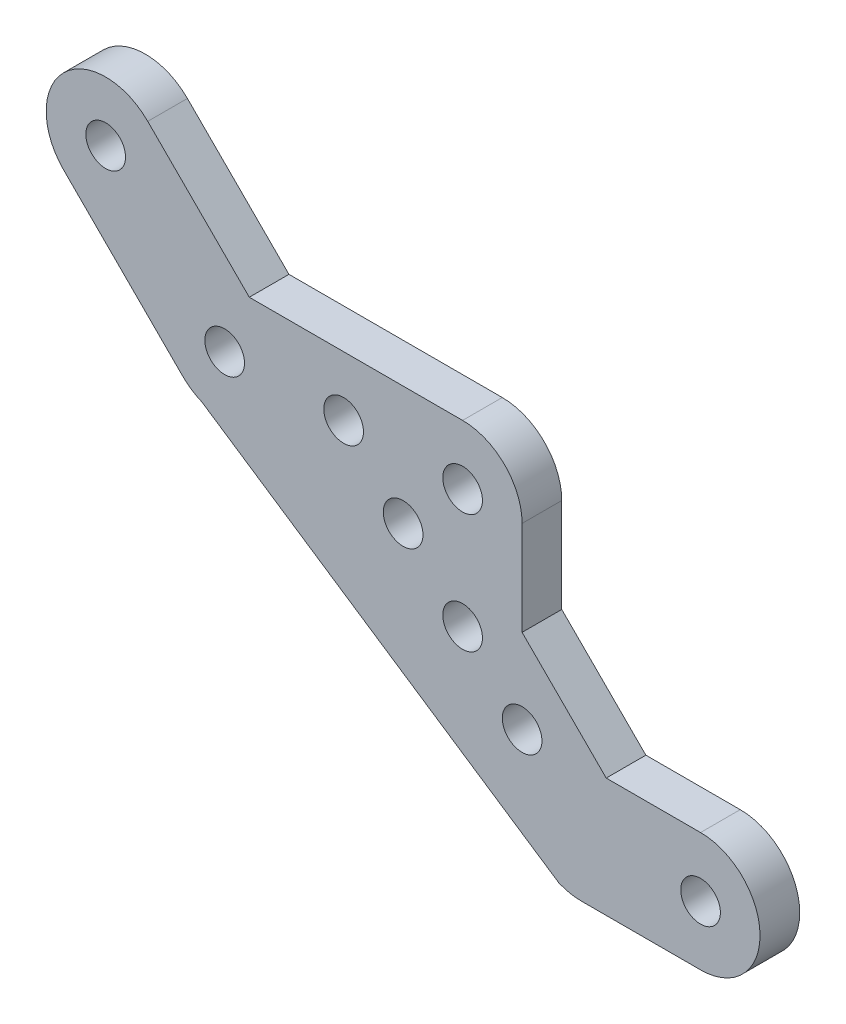
ISO-10303-21;
HEADER;
FILE_DESCRIPTION(('STEP AP214'),'2;1');
FILE_NAME('part.step','',(''),(''),'','','');
FILE_SCHEMA(('AUTOMOTIVE_DESIGN { 1 0 10303 214 1 1 1 1 }'));
ENDSEC;
DATA;
#1=APPLICATION_CONTEXT('core data for automotive mechanical design processes');
#2=APPLICATION_PROTOCOL_DEFINITION('international standard','automotive_design',2000,#1);
#3=PRODUCT_CONTEXT('',#1,'mechanical');
#4=PRODUCT('Part','Part','',(#3));
#5=PRODUCT_RELATED_PRODUCT_CATEGORY('part','',(#4));
#6=PRODUCT_DEFINITION_FORMATION('','',#4);
#7=PRODUCT_DEFINITION_CONTEXT('part definition',#1,'design');
#8=PRODUCT_DEFINITION('design','',#6,#7);
#9=PRODUCT_DEFINITION_SHAPE('','',#8);
#10=(LENGTH_UNIT() NAMED_UNIT(*) SI_UNIT(.MILLI.,.METRE.));
#11=(NAMED_UNIT(*) PLANE_ANGLE_UNIT() SI_UNIT($,.RADIAN.));
#12=(NAMED_UNIT(*) SI_UNIT($,.STERADIAN.) SOLID_ANGLE_UNIT());
#13=UNCERTAINTY_MEASURE_WITH_UNIT(LENGTH_MEASURE(1.E-05),#10,'distance_accuracy_value','');
#14=(GEOMETRIC_REPRESENTATION_CONTEXT(3) GLOBAL_UNCERTAINTY_ASSIGNED_CONTEXT((#13)) GLOBAL_UNIT_ASSIGNED_CONTEXT((#10,
#11,#12)) REPRESENTATION_CONTEXT('',''));
#15=CARTESIAN_POINT('',(0.,0.,0.));
#16=DIRECTION('',(0.,0.,1.));
#17=DIRECTION('',(1.,0.,0.));
#18=AXIS2_PLACEMENT_3D('',#15,#16,#17);
#19=CARTESIAN_POINT('',(215.821694642446,323.732541963669,3.));
#20=DIRECTION('',(0.554700196225229,0.832050294337844,0.));
#21=DIRECTION('',(-0.832050294337844,0.554700196225229,0.));
#22=AXIS2_PLACEMENT_3D('',#19,#20,#21);
#23=PLANE('',#22);
#24=DIRECTION('',(0.832050294337844,-0.554700196225229,0.));
#25=VECTOR('',#24,1.);
#26=CARTESIAN_POINT('',(215.821694642446,323.732541963669,0.));
#27=LINE('',#26,#25);
#28=CARTESIAN_POINT('',(421.5555703155,186.5766248483,0.));
#29=VERTEX_POINT('',#28);
#30=CARTESIAN_POINT('',(448.5555703155,168.5766248483,0.));
#31=VERTEX_POINT('',#30);
#32=EDGE_CURVE('E184',#29,#31,#27,.T.);
#33=ORIENTED_EDGE('',*,*,#32,.T.);
#34=DIRECTION('',(0.,0.,-1.));
#35=VECTOR('',#34,1.);
#36=CARTESIAN_POINT('',(448.5555703155,168.5766248483,3.));
#37=LINE('',#36,#35);
#38=CARTESIAN_POINT('',(448.5555703155,168.5766248483,3.));
#39=VERTEX_POINT('',#38);
#40=EDGE_CURVE('E11',#39,#31,#37,.T.);
#41=ORIENTED_EDGE('',*,*,#40,.F.);
#42=DIRECTION('',(0.832050294337844,-0.554700196225229,0.));
#43=VECTOR('',#42,1.);
#44=CARTESIAN_POINT('',(215.821694642446,323.732541963669,3.));
#45=LINE('',#44,#43);
#46=CARTESIAN_POINT('',(421.5555703155,186.5766248483,3.));
#47=VERTEX_POINT('',#46);
#48=EDGE_CURVE('E234',#47,#39,#45,.T.);
#49=ORIENTED_EDGE('',*,*,#48,.F.);
#50=DIRECTION('',(0.,0.,-1.));
#51=VECTOR('',#50,1.);
#52=CARTESIAN_POINT('',(421.5555703155,186.5766248483,3.));
#53=LINE('',#52,#51);
#54=EDGE_CURVE('E183',#47,#29,#53,.T.);
#55=ORIENTED_EDGE('',*,*,#54,.T.);
#56=EDGE_LOOP('',(#33,#41,#49,#55));
#57=FACE_BOUND('',#56,.T.);
#58=ADVANCED_FACE('F33',(#57),#23,.F.);
#59=CARTESIAN_POINT('',(450.2776457611,172.7340827446,3.));
#60=DIRECTION('',(0.,0.,-1.));
#61=DIRECTION('',(-1.,0.,0.));
#62=AXIS2_PLACEMENT_3D('',#59,#60,#61);
#63=CYLINDRICAL_SURFACE('',#62,4.49999999999142);
#64=CARTESIAN_POINT('',(450.2776457611,172.7340827446,0.));
#65=DIRECTION('',(0.,0.,1.));
#66=DIRECTION('',(1.,0.,0.));
#67=AXIS2_PLACEMENT_3D('',#64,#65,#66);
#68=CIRCLE('',#67,4.49999999999142);
#69=CARTESIAN_POINT('',(450.2776457611,168.2340827446,0.));
#70=VERTEX_POINT('',#69);
#71=EDGE_CURVE('E187',#31,#70,#68,.T.);
#72=ORIENTED_EDGE('',*,*,#71,.T.);
#73=DIRECTION('',(0.,0.,-1.));
#74=VECTOR('',#73,1.);
#75=CARTESIAN_POINT('',(450.2776457611,168.2340827446,3.));
#76=LINE('',#75,#74);
#77=CARTESIAN_POINT('',(450.2776457611,168.2340827446,3.));
#78=VERTEX_POINT('',#77);
#79=EDGE_CURVE('E41',#78,#70,#76,.T.);
#80=ORIENTED_EDGE('',*,*,#79,.F.);
#81=CARTESIAN_POINT('',(450.2776457611,172.7340827446,3.));
#82=DIRECTION('',(0.,0.,1.));
#83=DIRECTION('',(1.,0.,0.));
#84=AXIS2_PLACEMENT_3D('',#81,#82,#83);
#85=CIRCLE('',#84,4.49999999999142);
#86=EDGE_CURVE('E107',#39,#78,#85,.T.);
#87=ORIENTED_EDGE('',*,*,#86,.F.);
#88=ORIENTED_EDGE('',*,*,#40,.T.);
#89=EDGE_LOOP('',(#72,#80,#87,#88));
#90=FACE_BOUND('',#89,.T.);
#91=ADVANCED_FACE('F323',(#90),#63,.T.);
#92=CARTESIAN_POINT('',(0.,168.2340827446,3.));
#93=DIRECTION('',(0.,1.,0.));
#94=DIRECTION('',(0.,0.,1.));
#95=AXIS2_PLACEMENT_3D('',#92,#93,#94);
#96=PLANE('',#95);
#97=DIRECTION('',(1.,0.,0.));
#98=VECTOR('',#97,1.);
#99=CARTESIAN_POINT('',(0.,168.2340827446,0.));
#100=LINE('',#99,#98);
#101=CARTESIAN_POINT('',(459.2776457611,168.2340827446,0.));
#102=VERTEX_POINT('',#101);
#103=EDGE_CURVE('E189',#70,#102,#100,.T.);
#104=ORIENTED_EDGE('',*,*,#103,.T.);
#105=DIRECTION('',(0.,0.,-1.));
#106=VECTOR('',#105,1.);
#107=CARTESIAN_POINT('',(459.2776457611,168.2340827446,3.));
#108=LINE('',#107,#106);
#109=CARTESIAN_POINT('',(459.2776457611,168.2340827446,3.));
#110=VERTEX_POINT('',#109);
#111=EDGE_CURVE('E254',#110,#102,#108,.T.);
#112=ORIENTED_EDGE('',*,*,#111,.F.);
#113=DIRECTION('',(1.,0.,0.));
#114=VECTOR('',#113,1.);
#115=CARTESIAN_POINT('',(0.,168.2340827446,3.));
#116=LINE('',#115,#114);
#117=EDGE_CURVE('E262',#78,#110,#116,.T.);
#118=ORIENTED_EDGE('',*,*,#117,.F.);
#119=ORIENTED_EDGE('',*,*,#79,.T.);
#120=EDGE_LOOP('',(#104,#112,#118,#119));
#121=FACE_BOUND('',#120,.T.);
#122=ADVANCED_FACE('F260',(#121),#96,.F.);
#123=CARTESIAN_POINT('',(459.2776457611,172.7340827446,3.));
#124=DIRECTION('',(0.,0.,-1.));
#125=DIRECTION('',(-1.,0.,0.));
#126=AXIS2_PLACEMENT_3D('',#123,#124,#125);
#127=CYLINDRICAL_SURFACE('',#126,4.49999999999999);
#128=CARTESIAN_POINT('',(459.2776457611,172.7340827446,0.));
#129=DIRECTION('',(0.,0.,1.));
#130=DIRECTION('',(1.,0.,0.));
#131=AXIS2_PLACEMENT_3D('',#128,#129,#130);
#132=CIRCLE('',#131,4.49999999999999);
#133=CARTESIAN_POINT('',(459.2776457611,177.2340827446,0.));
#134=VERTEX_POINT('',#133);
#135=EDGE_CURVE('E191',#102,#134,#132,.T.);
#136=ORIENTED_EDGE('',*,*,#135,.T.);
#137=DIRECTION('',(0.,0.,-1.));
#138=VECTOR('',#137,1.);
#139=CARTESIAN_POINT('',(459.2776457611,177.2340827446,3.));
#140=LINE('',#139,#138);
#141=CARTESIAN_POINT('',(459.2776457611,177.2340827446,3.));
#142=VERTEX_POINT('',#141);
#143=EDGE_CURVE('E251',#142,#134,#140,.T.);
#144=ORIENTED_EDGE('',*,*,#143,.F.);
#145=CARTESIAN_POINT('',(459.2776457611,172.7340827446,3.));
#146=DIRECTION('',(0.,0.,1.));
#147=DIRECTION('',(1.,0.,0.));
#148=AXIS2_PLACEMENT_3D('',#145,#146,#147);
#149=CIRCLE('',#148,4.49999999999999);
#150=EDGE_CURVE('E281',#110,#142,#149,.T.);
#151=ORIENTED_EDGE('',*,*,#150,.F.);
#152=ORIENTED_EDGE('',*,*,#111,.T.);
#153=EDGE_LOOP('',(#136,#144,#151,#152));
#154=FACE_BOUND('',#153,.T.);
#155=ADVANCED_FACE('F272',(#154),#127,.T.);
#156=CARTESIAN_POINT('',(0.,177.2340827446,3.));
#157=DIRECTION('',(0.,-1.,0.));
#158=DIRECTION('',(0.,0.,-1.));
#159=AXIS2_PLACEMENT_3D('',#156,#157,#158);
#160=PLANE('',#159);
#161=DIRECTION('',(-1.,0.,0.));
#162=VECTOR('',#161,1.);
#163=CARTESIAN_POINT('',(0.,177.2340827446,0.));
#164=LINE('',#163,#162);
#165=CARTESIAN_POINT('',(452.1416067918,177.2340827446,0.));
#166=VERTEX_POINT('',#165);
#167=EDGE_CURVE('E193',#134,#166,#164,.T.);
#168=ORIENTED_EDGE('',*,*,#167,.T.);
#169=DIRECTION('',(0.,0.,-1.));
#170=VECTOR('',#169,1.);
#171=CARTESIAN_POINT('',(452.1416067918,177.2340827446,3.));
#172=LINE('',#171,#170);
#173=CARTESIAN_POINT('',(452.1416067918,177.2340827446,3.));
#174=VERTEX_POINT('',#173);
#175=EDGE_CURVE('E248',#174,#166,#172,.T.);
#176=ORIENTED_EDGE('',*,*,#175,.F.);
#177=DIRECTION('',(-1.,0.,0.));
#178=VECTOR('',#177,1.);
#179=CARTESIAN_POINT('',(0.,177.2340827446,3.));
#180=LINE('',#179,#178);
#181=EDGE_CURVE('E278',#142,#174,#180,.T.);
#182=ORIENTED_EDGE('',*,*,#181,.F.);
#183=ORIENTED_EDGE('',*,*,#143,.T.);
#184=EDGE_LOOP('',(#168,#176,#182,#183));
#185=FACE_BOUND('',#184,.T.);
#186=ADVANCED_FACE('F276',(#185),#160,.F.);
#187=CARTESIAN_POINT('',(314.687844768202,314.687844768199,3.));
#188=DIRECTION('',(-0.70710678118655,-0.707106781186544,0.));
#189=DIRECTION('',(0.707106781186545,-0.707106781186551,0.));
#190=AXIS2_PLACEMENT_3D('',#187,#188,#189);
#191=PLANE('',#190);
#192=DIRECTION('',(-0.707106781186544,0.707106781186551,0.));
#193=VECTOR('',#192,1.);
#194=CARTESIAN_POINT('',(314.687844768202,314.687844768199,0.));
#195=LINE('',#194,#193);
#196=CARTESIAN_POINT('',(445.7776457611,183.5980437753,0.));
#197=VERTEX_POINT('',#196);
#198=EDGE_CURVE('E195',#166,#197,#195,.T.);
#199=ORIENTED_EDGE('',*,*,#198,.T.);
#200=DIRECTION('',(0.,0.,-1.));
#201=VECTOR('',#200,1.);
#202=CARTESIAN_POINT('',(445.7776457611,183.5980437753,3.));
#203=LINE('',#202,#201);
#204=CARTESIAN_POINT('',(445.7776457611,183.5980437753,3.));
#205=VERTEX_POINT('',#204);
#206=EDGE_CURVE('E246',#205,#197,#203,.T.);
#207=ORIENTED_EDGE('',*,*,#206,.F.);
#208=DIRECTION('',(-0.707106781186544,0.707106781186551,0.));
#209=VECTOR('',#208,1.);
#210=CARTESIAN_POINT('',(314.687844768202,314.687844768199,3.));
#211=LINE('',#210,#209);
#212=EDGE_CURVE('E280',#174,#205,#211,.T.);
#213=ORIENTED_EDGE('',*,*,#212,.F.);
#214=ORIENTED_EDGE('',*,*,#175,.T.);
#215=EDGE_LOOP('',(#199,#207,#213,#214));
#216=FACE_BOUND('',#215,.T.);
#217=ADVANCED_FACE('F336',(#216),#191,.F.);
#218=CARTESIAN_POINT('',(445.7776457611,0.,3.));
#219=DIRECTION('',(1.,0.,0.));
#220=DIRECTION('',(0.,0.,-1.));
#221=AXIS2_PLACEMENT_3D('',#218,#219,#220);
#222=PLANE('',#221);
#223=DIRECTION('',(0.,-1.,0.));
#224=VECTOR('',#223,1.);
#225=CARTESIAN_POINT('',(445.7776457611,0.,0.));
#226=LINE('',#225,#224);
#227=CARTESIAN_POINT('',(445.7776457611,190.7340827446,0.));
#228=VERTEX_POINT('',#227);
#229=EDGE_CURVE('E198',#228,#197,#226,.T.);
#230=ORIENTED_EDGE('',*,*,#229,.F.);
#231=DIRECTION('',(0.,0.,-1.));
#232=VECTOR('',#231,1.);
#233=CARTESIAN_POINT('',(445.7776457611,190.7340827446,3.));
#234=LINE('',#233,#232);
#235=CARTESIAN_POINT('',(445.7776457611,190.7340827446,3.));
#236=VERTEX_POINT('',#235);
#237=EDGE_CURVE('E244',#236,#228,#234,.T.);
#238=ORIENTED_EDGE('',*,*,#237,.F.);
#239=DIRECTION('',(0.,-1.,0.));
#240=VECTOR('',#239,1.);
#241=CARTESIAN_POINT('',(445.7776457611,0.,3.));
#242=LINE('',#241,#240);
#243=EDGE_CURVE('E283',#236,#205,#242,.T.);
#244=ORIENTED_EDGE('',*,*,#243,.T.);
#245=ORIENTED_EDGE('',*,*,#206,.T.);
#246=EDGE_LOOP('',(#230,#238,#244,#245));
#247=FACE_BOUND('',#246,.T.);
#248=ADVANCED_FACE('F339',(#247),#222,.T.);
#249=CARTESIAN_POINT('',(441.2776457611,190.7340827446,3.));
#250=DIRECTION('',(0.,0.,-1.));
#251=DIRECTION('',(-1.,0.,0.));
#252=AXIS2_PLACEMENT_3D('',#249,#250,#251);
#253=CYLINDRICAL_SURFACE('',#252,4.5);
#254=CARTESIAN_POINT('',(441.2776457611,190.7340827446,0.));
#255=DIRECTION('',(0.,0.,1.));
#256=DIRECTION('',(1.,0.,0.));
#257=AXIS2_PLACEMENT_3D('',#254,#255,#256);
#258=CIRCLE('',#257,4.5);
#259=CARTESIAN_POINT('',(441.2776457611,195.2340827446,0.));
#260=VERTEX_POINT('',#259);
#261=EDGE_CURVE('E201',#228,#260,#258,.T.);
#262=ORIENTED_EDGE('',*,*,#261,.T.);
#263=DIRECTION('',(0.,0.,-1.));
#264=VECTOR('',#263,1.);
#265=CARTESIAN_POINT('',(441.2776457611,195.2340827446,3.));
#266=LINE('',#265,#264);
#267=CARTESIAN_POINT('',(441.2776457611,195.2340827446,3.));
#268=VERTEX_POINT('',#267);
#269=EDGE_CURVE('E241',#268,#260,#266,.T.);
#270=ORIENTED_EDGE('',*,*,#269,.F.);
#271=CARTESIAN_POINT('',(441.2776457611,190.7340827446,3.));
#272=DIRECTION('',(0.,0.,1.));
#273=DIRECTION('',(1.,0.,0.));
#274=AXIS2_PLACEMENT_3D('',#271,#272,#273);
#275=CIRCLE('',#274,4.5);
#276=EDGE_CURVE('E290',#236,#268,#275,.T.);
#277=ORIENTED_EDGE('',*,*,#276,.F.);
#278=ORIENTED_EDGE('',*,*,#237,.T.);
#279=EDGE_LOOP('',(#262,#270,#277,#278));
#280=FACE_BOUND('',#279,.T.);
#281=ADVANCED_FACE('F343',(#280),#253,.T.);
#282=CARTESIAN_POINT('',(0.,195.2340827446,3.));
#283=DIRECTION('',(0.,-1.,0.));
#284=DIRECTION('',(0.,0.,-1.));
#285=AXIS2_PLACEMENT_3D('',#282,#283,#284);
#286=PLANE('',#285);
#287=DIRECTION('',(-1.,0.,0.));
#288=VECTOR('',#287,1.);
#289=CARTESIAN_POINT('',(0.,195.2340827446,0.));
#290=LINE('',#289,#288);
#291=CARTESIAN_POINT('',(425.1416067918,195.2340827446,0.));
#292=VERTEX_POINT('',#291);
#293=EDGE_CURVE('E203',#260,#292,#290,.T.);
#294=ORIENTED_EDGE('',*,*,#293,.T.);
#295=DIRECTION('',(0.,0.,-1.));
#296=VECTOR('',#295,1.);
#297=CARTESIAN_POINT('',(425.1416067918,195.2340827446,3.));
#298=LINE('',#297,#296);
#299=CARTESIAN_POINT('',(425.1416067918,195.2340827446,3.));
#300=VERTEX_POINT('',#299);
#301=EDGE_CURVE('E238',#300,#292,#298,.T.);
#302=ORIENTED_EDGE('',*,*,#301,.F.);
#303=DIRECTION('',(-1.,0.,0.));
#304=VECTOR('',#303,1.);
#305=CARTESIAN_POINT('',(0.,195.2340827446,3.));
#306=LINE('',#305,#304);
#307=EDGE_CURVE('E292',#268,#300,#306,.T.);
#308=ORIENTED_EDGE('',*,*,#307,.F.);
#309=ORIENTED_EDGE('',*,*,#269,.T.);
#310=EDGE_LOOP('',(#294,#302,#308,#309));
#311=FACE_BOUND('',#310,.T.);
#312=ADVANCED_FACE('F299',(#311),#286,.F.);
#313=CARTESIAN_POINT('',(310.187844765434,310.18784476947,3.));
#314=DIRECTION('',(-0.707106781181946,-0.707106781191149,0.));
#315=DIRECTION('',(0.707106781191149,-0.707106781181946,0.));
#316=AXIS2_PLACEMENT_3D('',#313,#314,#315);
#317=PLANE('',#316);
#318=DIRECTION('',(-0.707106781191149,0.707106781181946,0.));
#319=VECTOR('',#318,1.);
#320=CARTESIAN_POINT('',(310.187844765434,310.18784476947,0.));
#321=LINE('',#320,#319);
#322=CARTESIAN_POINT('',(417.4596262764,202.9160632599,0.));
#323=VERTEX_POINT('',#322);
#324=EDGE_CURVE('E205',#292,#323,#321,.T.);
#325=ORIENTED_EDGE('',*,*,#324,.T.);
#326=DIRECTION('',(0.,0.,-1.));
#327=VECTOR('',#326,1.);
#328=CARTESIAN_POINT('',(417.4596262764,202.9160632599,3.));
#329=LINE('',#328,#327);
#330=CARTESIAN_POINT('',(417.4596262764,202.9160632599,3.));
#331=VERTEX_POINT('',#330);
#332=EDGE_CURVE('E151',#331,#323,#329,.T.);
#333=ORIENTED_EDGE('',*,*,#332,.F.);
#334=DIRECTION('',(-0.707106781191149,0.707106781181946,0.));
#335=VECTOR('',#334,1.);
#336=CARTESIAN_POINT('',(310.187844765434,310.18784476947,3.));
#337=LINE('',#336,#335);
#338=EDGE_CURVE('E142',#300,#331,#337,.T.);
#339=ORIENTED_EDGE('',*,*,#338,.F.);
#340=ORIENTED_EDGE('',*,*,#301,.T.);
#341=EDGE_LOOP('',(#325,#333,#339,#340));
#342=FACE_BOUND('',#341,.T.);
#343=ADVANCED_FACE('F303',(#342),#317,.F.);
#344=CARTESIAN_POINT('',(414.2776457611,199.7340827446,3.));
#345=DIRECTION('',(0.,0.,-1.));
#346=DIRECTION('',(-1.,0.,0.));
#347=AXIS2_PLACEMENT_3D('',#344,#345,#346);
#348=CYLINDRICAL_SURFACE('',#347,4.49999999994419);
#349=CARTESIAN_POINT('',(414.2776457611,199.7340827446,0.));
#350=DIRECTION('',(0.,0.,1.));
#351=DIRECTION('',(1.,0.,0.));
#352=AXIS2_PLACEMENT_3D('',#349,#350,#351);
#353=CIRCLE('',#352,4.49999999994419);
#354=CARTESIAN_POINT('',(411.0956652458,196.5521022293,0.));
#355=VERTEX_POINT('',#354);
#356=EDGE_CURVE('E150',#323,#355,#353,.T.);
#357=ORIENTED_EDGE('',*,*,#356,.T.);
#358=DIRECTION('',(0.,0.,-1.));
#359=VECTOR('',#358,1.);
#360=CARTESIAN_POINT('',(411.0956652458,196.5521022293,3.));
#361=LINE('',#360,#359);
#362=CARTESIAN_POINT('',(411.0956652458,196.5521022293,3.));
#363=VERTEX_POINT('',#362);
#364=EDGE_CURVE('E147',#363,#355,#361,.T.);
#365=ORIENTED_EDGE('',*,*,#364,.F.);
#366=CARTESIAN_POINT('',(414.2776457611,199.7340827446,3.));
#367=DIRECTION('',(0.,0.,1.));
#368=DIRECTION('',(1.,0.,0.));
#369=AXIS2_PLACEMENT_3D('',#366,#367,#368);
#370=CIRCLE('',#369,4.49999999994419);
#371=EDGE_CURVE('E135',#331,#363,#370,.T.);
#372=ORIENTED_EDGE('',*,*,#371,.F.);
#373=ORIENTED_EDGE('',*,*,#332,.T.);
#374=EDGE_LOOP('',(#357,#365,#372,#373));
#375=FACE_BOUND('',#374,.T.);
#376=ADVANCED_FACE('F148',(#375),#348,.T.);
#377=CARTESIAN_POINT('',(303.823883737549,303.82388373755,3.));
#378=DIRECTION('',(0.707106781186546,0.707106781186548,0.));
#379=DIRECTION('',(-0.707106781186549,0.707106781186546,0.));
#380=AXIS2_PLACEMENT_3D('',#377,#378,#379);
#381=PLANE('',#380);
#382=DIRECTION('',(0.707106781186549,-0.707106781186546,0.));
#383=VECTOR('',#382,1.);
#384=CARTESIAN_POINT('',(303.823883737549,303.82388373755,0.));
#385=LINE('',#384,#383);
#386=CARTESIAN_POINT('',(420.0956652458,187.5521022293,0.));
#387=VERTEX_POINT('',#386);
#388=EDGE_CURVE('E93',#355,#387,#385,.T.);
#389=ORIENTED_EDGE('',*,*,#388,.T.);
#390=DIRECTION('',(0.,0.,-1.));
#391=VECTOR('',#390,1.);
#392=CARTESIAN_POINT('',(420.0956652458,187.5521022293,3.));
#393=LINE('',#392,#391);
#394=CARTESIAN_POINT('',(420.0956652458,187.5521022293,3.));
#395=VERTEX_POINT('',#394);
#396=EDGE_CURVE('E152',#395,#387,#393,.T.);
#397=ORIENTED_EDGE('',*,*,#396,.F.);
#398=DIRECTION('',(0.707106781186549,-0.707106781186546,0.));
#399=VECTOR('',#398,1.);
#400=CARTESIAN_POINT('',(303.823883737549,303.82388373755,3.));
#401=LINE('',#400,#399);
#402=EDGE_CURVE('E140',#363,#395,#401,.T.);
#403=ORIENTED_EDGE('',*,*,#402,.F.);
#404=ORIENTED_EDGE('',*,*,#364,.T.);
#405=EDGE_LOOP('',(#389,#397,#403,#404));
#406=FACE_BOUND('',#405,.T.);
#407=ADVANCED_FACE('F154',(#406),#381,.F.);
#408=CARTESIAN_POINT('',(432.2776457611,190.7340827446,3.));
#409=DIRECTION('',(0.,0.,-1.));
#410=DIRECTION('',(-1.,0.,0.));
#411=AXIS2_PLACEMENT_3D('',#408,#409,#410);
#412=CYLINDRICAL_SURFACE('',#411,1.5);
#413=CARTESIAN_POINT('',(432.2776457611,190.7340827446,3.));
#414=DIRECTION('',(0.,0.,1.));
#415=DIRECTION('',(1.,0.,0.));
#416=AXIS2_PLACEMENT_3D('',#413,#414,#415);
#417=CIRCLE('',#416,1.5);
#418=CARTESIAN_POINT('',(433.7776457611,190.7340827446,3.));
#419=VERTEX_POINT('',#418);
#420=EDGE_CURVE('E177',#419,#419,#417,.T.);
#421=ORIENTED_EDGE('',*,*,#420,.T.);
#422=EDGE_LOOP('',(#421));
#423=FACE_BOUND('',#422,.T.);
#424=CARTESIAN_POINT('',(432.2776457611,190.7340827446,0.));
#425=DIRECTION('',(0.,0.,1.));
#426=DIRECTION('',(1.,0.,0.));
#427=AXIS2_PLACEMENT_3D('',#424,#425,#426);
#428=CIRCLE('',#427,1.5);
#429=CARTESIAN_POINT('',(433.7776457611,190.7340827446,0.));
#430=VERTEX_POINT('',#429);
#431=EDGE_CURVE('E228',#430,#430,#428,.T.);
#432=ORIENTED_EDGE('',*,*,#431,.F.);
#433=EDGE_LOOP('',(#432));
#434=FACE_BOUND('',#433,.T.);
#435=ADVANCED_FACE('F354',(#423,#434),#412,.F.);
#436=CARTESIAN_POINT('',(423.2776457611,190.7340827446,3.));
#437=DIRECTION('',(0.,0.,-1.));
#438=DIRECTION('',(-1.,0.,0.));
#439=AXIS2_PLACEMENT_3D('',#436,#437,#438);
#440=CYLINDRICAL_SURFACE('',#439,1.5);
#441=CARTESIAN_POINT('',(423.2776457611,190.7340827446,3.));
#442=DIRECTION('',(0.,0.,1.));
#443=DIRECTION('',(1.,0.,0.));
#444=AXIS2_PLACEMENT_3D('',#441,#442,#443);
#445=CIRCLE('',#444,1.5);
#446=CARTESIAN_POINT('',(424.7776457611,190.7340827446,3.));
#447=VERTEX_POINT('',#446);
#448=EDGE_CURVE('E174',#447,#447,#445,.T.);
#449=ORIENTED_EDGE('',*,*,#448,.T.);
#450=EDGE_LOOP('',(#449));
#451=FACE_BOUND('',#450,.T.);
#452=CARTESIAN_POINT('',(423.2776457611,190.7340827446,0.));
#453=DIRECTION('',(0.,0.,1.));
#454=DIRECTION('',(1.,0.,0.));
#455=AXIS2_PLACEMENT_3D('',#452,#453,#454);
#456=CIRCLE('',#455,1.5);
#457=CARTESIAN_POINT('',(424.7776457611,190.7340827446,0.));
#458=VERTEX_POINT('',#457);
#459=EDGE_CURVE('E225',#458,#458,#456,.T.);
#460=ORIENTED_EDGE('',*,*,#459,.F.);
#461=EDGE_LOOP('',(#460));
#462=FACE_BOUND('',#461,.T.);
#463=ADVANCED_FACE('F358',(#451,#462),#440,.F.);
#464=CARTESIAN_POINT('',(459.2776457611,172.7340827446,3.));
#465=DIRECTION('',(0.,0.,-1.));
#466=DIRECTION('',(-1.,0.,0.));
#467=AXIS2_PLACEMENT_3D('',#464,#465,#466);
#468=CYLINDRICAL_SURFACE('',#467,1.5);
#469=CARTESIAN_POINT('',(459.2776457611,172.7340827446,3.));
#470=DIRECTION('',(0.,0.,1.));
#471=DIRECTION('',(1.,0.,0.));
#472=AXIS2_PLACEMENT_3D('',#469,#470,#471);
#473=CIRCLE('',#472,1.5);
#474=CARTESIAN_POINT('',(460.7776457611,172.7340827446,3.));
#475=VERTEX_POINT('',#474);
#476=EDGE_CURVE('E171',#475,#475,#473,.T.);
#477=ORIENTED_EDGE('',*,*,#476,.T.);
#478=EDGE_LOOP('',(#477));
#479=FACE_BOUND('',#478,.T.);
#480=CARTESIAN_POINT('',(459.2776457611,172.7340827446,0.));
#481=DIRECTION('',(0.,0.,1.));
#482=DIRECTION('',(1.,0.,0.));
#483=AXIS2_PLACEMENT_3D('',#480,#481,#482);
#484=CIRCLE('',#483,1.5);
#485=CARTESIAN_POINT('',(460.7776457611,172.7340827446,0.));
#486=VERTEX_POINT('',#485);
#487=EDGE_CURVE('E222',#486,#486,#484,.T.);
#488=ORIENTED_EDGE('',*,*,#487,.F.);
#489=EDGE_LOOP('',(#488));
#490=FACE_BOUND('',#489,.T.);
#491=ADVANCED_FACE('F364',(#479,#490),#468,.F.);
#492=CARTESIAN_POINT('',(441.2776457611,190.7340827446,3.));
#493=DIRECTION('',(0.,0.,-1.));
#494=DIRECTION('',(-1.,0.,0.));
#495=AXIS2_PLACEMENT_3D('',#492,#493,#494);
#496=CYLINDRICAL_SURFACE('',#495,1.5);
#497=CARTESIAN_POINT('',(441.2776457611,190.7340827446,3.));
#498=DIRECTION('',(0.,0.,1.));
#499=DIRECTION('',(1.,0.,0.));
#500=AXIS2_PLACEMENT_3D('',#497,#498,#499);
#501=CIRCLE('',#500,1.5);
#502=CARTESIAN_POINT('',(442.7776457611,190.7340827446,3.));
#503=VERTEX_POINT('',#502);
#504=EDGE_CURVE('E168',#503,#503,#501,.T.);
#505=ORIENTED_EDGE('',*,*,#504,.T.);
#506=EDGE_LOOP('',(#505));
#507=FACE_BOUND('',#506,.T.);
#508=CARTESIAN_POINT('',(441.2776457611,190.7340827446,0.));
#509=DIRECTION('',(0.,0.,1.));
#510=DIRECTION('',(1.,0.,0.));
#511=AXIS2_PLACEMENT_3D('',#508,#509,#510);
#512=CIRCLE('',#511,1.5);
#513=CARTESIAN_POINT('',(442.7776457611,190.7340827446,0.));
#514=VERTEX_POINT('',#513);
#515=EDGE_CURVE('E219',#514,#514,#512,.T.);
#516=ORIENTED_EDGE('',*,*,#515,.F.);
#517=EDGE_LOOP('',(#516));
#518=FACE_BOUND('',#517,.T.);
#519=ADVANCED_FACE('F372',(#507,#518),#496,.F.);
#520=CARTESIAN_POINT('',(441.2776457611,181.7340827446,3.));
#521=DIRECTION('',(0.,0.,-1.));
#522=DIRECTION('',(-1.,0.,0.));
#523=AXIS2_PLACEMENT_3D('',#520,#521,#522);
#524=CYLINDRICAL_SURFACE('',#523,1.5);
#525=CARTESIAN_POINT('',(441.2776457611,181.7340827446,3.));
#526=DIRECTION('',(0.,0.,1.));
#527=DIRECTION('',(1.,0.,0.));
#528=AXIS2_PLACEMENT_3D('',#525,#526,#527);
#529=CIRCLE('',#528,1.5);
#530=CARTESIAN_POINT('',(442.7776457611,181.7340827446,3.));
#531=VERTEX_POINT('',#530);
#532=EDGE_CURVE('E165',#531,#531,#529,.T.);
#533=ORIENTED_EDGE('',*,*,#532,.T.);
#534=EDGE_LOOP('',(#533));
#535=FACE_BOUND('',#534,.T.);
#536=CARTESIAN_POINT('',(441.2776457611,181.7340827446,0.));
#537=DIRECTION('',(0.,0.,1.));
#538=DIRECTION('',(1.,0.,0.));
#539=AXIS2_PLACEMENT_3D('',#536,#537,#538);
#540=CIRCLE('',#539,1.5);
#541=CARTESIAN_POINT('',(442.7776457611,181.7340827446,0.));
#542=VERTEX_POINT('',#541);
#543=EDGE_CURVE('E216',#542,#542,#540,.T.);
#544=ORIENTED_EDGE('',*,*,#543,.F.);
#545=EDGE_LOOP('',(#544));
#546=FACE_BOUND('',#545,.T.);
#547=ADVANCED_FACE('F376',(#535,#546),#524,.F.);
#548=CARTESIAN_POINT('',(436.7776457611,186.2340827446,3.));
#549=DIRECTION('',(0.,0.,-1.));
#550=DIRECTION('',(-1.,0.,0.));
#551=AXIS2_PLACEMENT_3D('',#548,#549,#550);
#552=CYLINDRICAL_SURFACE('',#551,1.5);
#553=CARTESIAN_POINT('',(436.7776457611,186.2340827446,3.));
#554=DIRECTION('',(0.,0.,1.));
#555=DIRECTION('',(1.,0.,0.));
#556=AXIS2_PLACEMENT_3D('',#553,#554,#555);
#557=CIRCLE('',#556,1.5);
#558=CARTESIAN_POINT('',(438.2776457611,186.2340827446,3.));
#559=VERTEX_POINT('',#558);
#560=EDGE_CURVE('E162',#559,#559,#557,.T.);
#561=ORIENTED_EDGE('',*,*,#560,.T.);
#562=EDGE_LOOP('',(#561));
#563=FACE_BOUND('',#562,.T.);
#564=CARTESIAN_POINT('',(436.7776457611,186.2340827446,0.));
#565=DIRECTION('',(0.,0.,1.));
#566=DIRECTION('',(1.,0.,0.));
#567=AXIS2_PLACEMENT_3D('',#564,#565,#566);
#568=CIRCLE('',#567,1.5);
#569=CARTESIAN_POINT('',(438.2776457611,186.2340827446,0.));
#570=VERTEX_POINT('',#569);
#571=EDGE_CURVE('E213',#570,#570,#568,.T.);
#572=ORIENTED_EDGE('',*,*,#571,.F.);
#573=EDGE_LOOP('',(#572));
#574=FACE_BOUND('',#573,.T.);
#575=ADVANCED_FACE('F318',(#563,#574),#552,.F.);
#576=CARTESIAN_POINT('',(445.7776457611,177.2340827446,3.));
#577=DIRECTION('',(0.,0.,-1.));
#578=DIRECTION('',(-1.,0.,0.));
#579=AXIS2_PLACEMENT_3D('',#576,#577,#578);
#580=CYLINDRICAL_SURFACE('',#579,1.5);
#581=CARTESIAN_POINT('',(445.7776457611,177.2340827446,3.));
#582=DIRECTION('',(0.,0.,1.));
#583=DIRECTION('',(1.,0.,0.));
#584=AXIS2_PLACEMENT_3D('',#581,#582,#583);
#585=CIRCLE('',#584,1.5);
#586=CARTESIAN_POINT('',(447.2776457611,177.2340827446,3.));
#587=VERTEX_POINT('',#586);
#588=EDGE_CURVE('E156',#587,#587,#585,.T.);
#589=ORIENTED_EDGE('',*,*,#588,.T.);
#590=EDGE_LOOP('',(#589));
#591=FACE_BOUND('',#590,.T.);
#592=CARTESIAN_POINT('',(445.7776457611,177.2340827446,0.));
#593=DIRECTION('',(0.,0.,1.));
#594=DIRECTION('',(1.,0.,0.));
#595=AXIS2_PLACEMENT_3D('',#592,#593,#594);
#596=CIRCLE('',#595,1.5);
#597=CARTESIAN_POINT('',(447.2776457611,177.2340827446,0.));
#598=VERTEX_POINT('',#597);
#599=EDGE_CURVE('E210',#598,#598,#596,.T.);
#600=ORIENTED_EDGE('',*,*,#599,.F.);
#601=EDGE_LOOP('',(#600));
#602=FACE_BOUND('',#601,.T.);
#603=ADVANCED_FACE('F310',(#591,#602),#580,.F.);
#604=CARTESIAN_POINT('',(423.2776457611,190.7340827446,3.));
#605=DIRECTION('',(0.,0.,-1.));
#606=DIRECTION('',(-1.,0.,0.));
#607=AXIS2_PLACEMENT_3D('',#604,#605,#606);
#608=CYLINDRICAL_SURFACE('',#607,4.49999999996353);
#609=CARTESIAN_POINT('',(423.2776457611,190.7340827446,0.));
#610=DIRECTION('',(0.,0.,1.));
#611=DIRECTION('',(1.,0.,0.));
#612=AXIS2_PLACEMENT_3D('',#609,#610,#611);
#613=CIRCLE('',#612,4.49999999996353);
#614=EDGE_CURVE('E99',#387,#29,#613,.T.);
#615=ORIENTED_EDGE('',*,*,#614,.T.);
#616=ORIENTED_EDGE('',*,*,#54,.F.);
#617=CARTESIAN_POINT('',(423.2776457611,190.7340827446,3.));
#618=DIRECTION('',(0.,0.,1.));
#619=DIRECTION('',(1.,0.,0.));
#620=AXIS2_PLACEMENT_3D('',#617,#618,#619);
#621=CIRCLE('',#620,4.49999999996353);
#622=EDGE_CURVE('E49',#395,#47,#621,.T.);
#623=ORIENTED_EDGE('',*,*,#622,.F.);
#624=ORIENTED_EDGE('',*,*,#396,.T.);
#625=EDGE_LOOP('',(#615,#616,#623,#624));
#626=FACE_BOUND('',#625,.T.);
#627=ADVANCED_FACE('F307',(#626),#608,.T.);
#628=CARTESIAN_POINT('',(414.2776457611,199.7340827446,3.));
#629=DIRECTION('',(0.,0.,-1.));
#630=DIRECTION('',(-1.,0.,0.));
#631=AXIS2_PLACEMENT_3D('',#628,#629,#630);
#632=CYLINDRICAL_SURFACE('',#631,1.5);
#633=CARTESIAN_POINT('',(414.2776457611,199.7340827446,3.));
#634=DIRECTION('',(0.,0.,1.));
#635=DIRECTION('',(1.,0.,0.));
#636=AXIS2_PLACEMENT_3D('',#633,#634,#635);
#637=CIRCLE('',#636,1.5);
#638=CARTESIAN_POINT('',(415.7776457611,199.7340827446,3.));
#639=VERTEX_POINT('',#638);
#640=EDGE_CURVE('E180',#639,#639,#637,.T.);
#641=ORIENTED_EDGE('',*,*,#640,.T.);
#642=EDGE_LOOP('',(#641));
#643=FACE_BOUND('',#642,.T.);
#644=CARTESIAN_POINT('',(414.2776457611,199.7340827446,0.));
#645=DIRECTION('',(0.,0.,1.));
#646=DIRECTION('',(1.,0.,0.));
#647=AXIS2_PLACEMENT_3D('',#644,#645,#646);
#648=CIRCLE('',#647,1.5);
#649=CARTESIAN_POINT('',(415.7776457611,199.7340827446,0.));
#650=VERTEX_POINT('',#649);
#651=EDGE_CURVE('E231',#650,#650,#648,.T.);
#652=ORIENTED_EDGE('',*,*,#651,.F.);
#653=EDGE_LOOP('',(#652));
#654=FACE_BOUND('',#653,.T.);
#655=ADVANCED_FACE('F309',(#643,#654),#632,.F.);
#656=CARTESIAN_POINT('',(0.,0.,3.));
#657=DIRECTION('',(0.,0.,1.));
#658=DIRECTION('',(1.,0.,0.));
#659=AXIS2_PLACEMENT_3D('',#656,#657,#658);
#660=PLANE('',#659);
#661=ORIENTED_EDGE('',*,*,#48,.T.);
#662=ORIENTED_EDGE('',*,*,#86,.T.);
#663=ORIENTED_EDGE('',*,*,#117,.T.);
#664=ORIENTED_EDGE('',*,*,#150,.T.);
#665=ORIENTED_EDGE('',*,*,#181,.T.);
#666=ORIENTED_EDGE('',*,*,#212,.T.);
#667=ORIENTED_EDGE('',*,*,#243,.F.);
#668=ORIENTED_EDGE('',*,*,#276,.T.);
#669=ORIENTED_EDGE('',*,*,#307,.T.);
#670=ORIENTED_EDGE('',*,*,#338,.T.);
#671=ORIENTED_EDGE('',*,*,#371,.T.);
#672=ORIENTED_EDGE('',*,*,#402,.T.);
#673=ORIENTED_EDGE('',*,*,#622,.T.);
#674=EDGE_LOOP('',(#661,#662,#663,#664,#665,#666,#667,#668,#669,#670,#671,#672,#673));
#675=FACE_BOUND('',#674,.T.);
#676=ORIENTED_EDGE('',*,*,#588,.F.);
#677=EDGE_LOOP('',(#676));
#678=FACE_BOUND('',#677,.T.);
#679=ORIENTED_EDGE('',*,*,#560,.F.);
#680=EDGE_LOOP('',(#679));
#681=FACE_BOUND('',#680,.T.);
#682=ORIENTED_EDGE('',*,*,#532,.F.);
#683=EDGE_LOOP('',(#682));
#684=FACE_BOUND('',#683,.T.);
#685=ORIENTED_EDGE('',*,*,#504,.F.);
#686=EDGE_LOOP('',(#685));
#687=FACE_BOUND('',#686,.T.);
#688=ORIENTED_EDGE('',*,*,#476,.F.);
#689=EDGE_LOOP('',(#688));
#690=FACE_BOUND('',#689,.T.);
#691=ORIENTED_EDGE('',*,*,#448,.F.);
#692=EDGE_LOOP('',(#691));
#693=FACE_BOUND('',#692,.T.);
#694=ORIENTED_EDGE('',*,*,#420,.F.);
#695=EDGE_LOOP('',(#694));
#696=FACE_BOUND('',#695,.T.);
#697=ORIENTED_EDGE('',*,*,#640,.F.);
#698=EDGE_LOOP('',(#697));
#699=FACE_BOUND('',#698,.T.);
#700=ADVANCED_FACE('F137',(#675,#678,#681,#684,#687,#690,#693,#696,#699),#660,.T.);
#701=CARTESIAN_POINT('',(0.,0.,0.));
#702=DIRECTION('',(0.,0.,1.));
#703=DIRECTION('',(1.,0.,0.));
#704=AXIS2_PLACEMENT_3D('',#701,#702,#703);
#705=PLANE('',#704);
#706=ORIENTED_EDGE('',*,*,#32,.F.);
#707=ORIENTED_EDGE('',*,*,#614,.F.);
#708=ORIENTED_EDGE('',*,*,#388,.F.);
#709=ORIENTED_EDGE('',*,*,#356,.F.);
#710=ORIENTED_EDGE('',*,*,#324,.F.);
#711=ORIENTED_EDGE('',*,*,#293,.F.);
#712=ORIENTED_EDGE('',*,*,#261,.F.);
#713=ORIENTED_EDGE('',*,*,#229,.T.);
#714=ORIENTED_EDGE('',*,*,#198,.F.);
#715=ORIENTED_EDGE('',*,*,#167,.F.);
#716=ORIENTED_EDGE('',*,*,#135,.F.);
#717=ORIENTED_EDGE('',*,*,#103,.F.);
#718=ORIENTED_EDGE('',*,*,#71,.F.);
#719=EDGE_LOOP('',(#706,#707,#708,#709,#710,#711,#712,#713,#714,#715,#716,#717,#718));
#720=FACE_BOUND('',#719,.T.);
#721=ORIENTED_EDGE('',*,*,#599,.T.);
#722=EDGE_LOOP('',(#721));
#723=FACE_BOUND('',#722,.T.);
#724=ORIENTED_EDGE('',*,*,#571,.T.);
#725=EDGE_LOOP('',(#724));
#726=FACE_BOUND('',#725,.T.);
#727=ORIENTED_EDGE('',*,*,#543,.T.);
#728=EDGE_LOOP('',(#727));
#729=FACE_BOUND('',#728,.T.);
#730=ORIENTED_EDGE('',*,*,#515,.T.);
#731=EDGE_LOOP('',(#730));
#732=FACE_BOUND('',#731,.T.);
#733=ORIENTED_EDGE('',*,*,#487,.T.);
#734=EDGE_LOOP('',(#733));
#735=FACE_BOUND('',#734,.T.);
#736=ORIENTED_EDGE('',*,*,#459,.T.);
#737=EDGE_LOOP('',(#736));
#738=FACE_BOUND('',#737,.T.);
#739=ORIENTED_EDGE('',*,*,#431,.T.);
#740=EDGE_LOOP('',(#739));
#741=FACE_BOUND('',#740,.T.);
#742=ORIENTED_EDGE('',*,*,#651,.T.);
#743=EDGE_LOOP('',(#742));
#744=FACE_BOUND('',#743,.T.);
#745=ADVANCED_FACE('F266',(#720,#723,#726,#729,#732,#735,#738,#741,#744),#705,.F.);
#746=CLOSED_SHELL('',(#58,#91,#122,#155,#186,#217,#248,#281,#312,#343,#376,#407,#435,#463,#491,
#519,#547,#575,#603,#627,#655,#700,#745));
#747=MANIFOLD_SOLID_BREP('B2',#746);
#748=ADVANCED_BREP_SHAPE_REPRESENTATION('',(#18,#747),#14);
#749=SHAPE_DEFINITION_REPRESENTATION(#9,#748);
ENDSEC;
END-ISO-10303-21;
